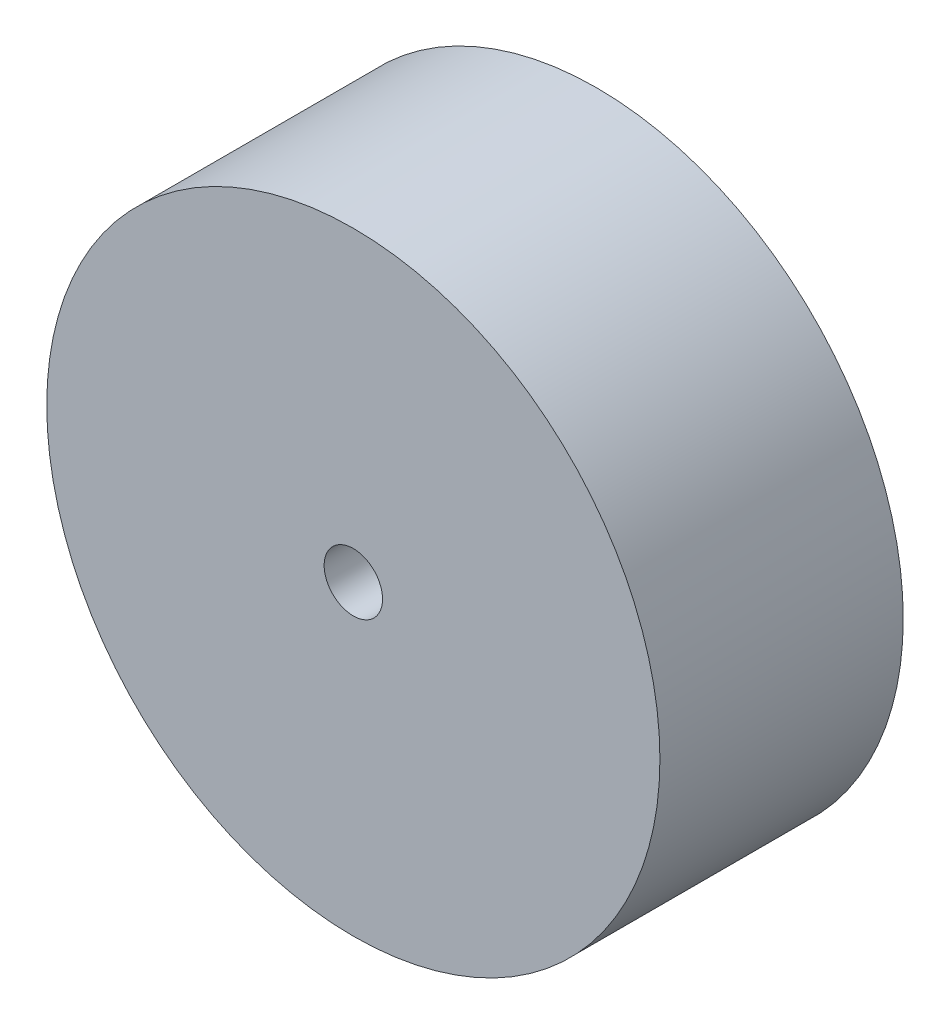
ISO-10303-21;
HEADER;
FILE_DESCRIPTION(('STEP AP214'),'2;1');
FILE_NAME('part.step','',(''),(''),'','','');
FILE_SCHEMA(('AUTOMOTIVE_DESIGN { 1 0 10303 214 1 1 1 1 }'));
ENDSEC;
DATA;
#1=APPLICATION_CONTEXT('core data for automotive mechanical design processes');
#2=APPLICATION_PROTOCOL_DEFINITION('international standard','automotive_design',2000,#1);
#3=PRODUCT_CONTEXT('',#1,'mechanical');
#4=PRODUCT('Part','Part','',(#3));
#5=PRODUCT_RELATED_PRODUCT_CATEGORY('part','',(#4));
#6=PRODUCT_DEFINITION_FORMATION('','',#4);
#7=PRODUCT_DEFINITION_CONTEXT('part definition',#1,'design');
#8=PRODUCT_DEFINITION('design','',#6,#7);
#9=PRODUCT_DEFINITION_SHAPE('','',#8);
#10=(LENGTH_UNIT() NAMED_UNIT(*) SI_UNIT(.MILLI.,.METRE.));
#11=(NAMED_UNIT(*) PLANE_ANGLE_UNIT() SI_UNIT($,.RADIAN.));
#12=(NAMED_UNIT(*) SI_UNIT($,.STERADIAN.) SOLID_ANGLE_UNIT());
#13=UNCERTAINTY_MEASURE_WITH_UNIT(LENGTH_MEASURE(1.E-05),#10,'distance_accuracy_value','');
#14=(GEOMETRIC_REPRESENTATION_CONTEXT(3) GLOBAL_UNCERTAINTY_ASSIGNED_CONTEXT((#13)) GLOBAL_UNIT_ASSIGNED_CONTEXT((#10,
#11,#12)) REPRESENTATION_CONTEXT('',''));
#15=CARTESIAN_POINT('',(0.,0.,0.));
#16=DIRECTION('',(0.,0.,1.));
#17=DIRECTION('',(1.,0.,0.));
#18=AXIS2_PLACEMENT_3D('',#15,#16,#17);
#19=CARTESIAN_POINT('',(0.,0.,25.));
#20=DIRECTION('',(0.,0.,-1.));
#21=DIRECTION('',(-1.,0.,0.));
#22=AXIS2_PLACEMENT_3D('',#19,#20,#21);
#23=CYLINDRICAL_SURFACE('',#22,31.5);
#24=CARTESIAN_POINT('',(0.,0.,25.));
#25=DIRECTION('',(0.,0.,1.));
#26=DIRECTION('',(1.,0.,0.));
#27=AXIS2_PLACEMENT_3D('',#24,#25,#26);
#28=CIRCLE('',#27,31.5);
#29=CARTESIAN_POINT('',(31.5,0.,25.));
#30=VERTEX_POINT('',#29);
#31=EDGE_CURVE('E10',#30,#30,#28,.T.);
#32=ORIENTED_EDGE('',*,*,#31,.F.);
#33=EDGE_LOOP('',(#32));
#34=FACE_BOUND('',#33,.T.);
#35=CARTESIAN_POINT('',(0.,0.,0.));
#36=DIRECTION('',(0.,0.,1.));
#37=DIRECTION('',(1.,0.,0.));
#38=AXIS2_PLACEMENT_3D('',#35,#36,#37);
#39=CIRCLE('',#38,31.5);
#40=CARTESIAN_POINT('',(31.5,0.,0.));
#41=VERTEX_POINT('',#40);
#42=EDGE_CURVE('E34',#41,#41,#39,.T.);
#43=ORIENTED_EDGE('',*,*,#42,.T.);
#44=EDGE_LOOP('',(#43));
#45=FACE_BOUND('',#44,.T.);
#46=ADVANCED_FACE('F31',(#34,#45),#23,.T.);
#47=CARTESIAN_POINT('',(0.,0.,25.));
#48=DIRECTION('',(0.,0.,1.));
#49=DIRECTION('',(1.,0.,0.));
#50=AXIS2_PLACEMENT_3D('',#47,#48,#49);
#51=PLANE('',#50);
#52=CARTESIAN_POINT('',(0.,0.,25.));
#53=DIRECTION('',(0.,0.,1.));
#54=DIRECTION('',(1.,0.,0.));
#55=AXIS2_PLACEMENT_3D('',#52,#53,#54);
#56=CIRCLE('',#55,3.);
#57=CARTESIAN_POINT('',(3.,0.,25.));
#58=VERTEX_POINT('',#57);
#59=EDGE_CURVE('E43',#58,#58,#56,.T.);
#60=ORIENTED_EDGE('',*,*,#59,.F.);
#61=EDGE_LOOP('',(#60));
#62=FACE_BOUND('',#61,.T.);
#63=ORIENTED_EDGE('',*,*,#31,.T.);
#64=EDGE_LOOP('',(#63));
#65=FACE_BOUND('',#64,.T.);
#66=ADVANCED_FACE('F58',(#62,#65),#51,.T.);
#67=CARTESIAN_POINT('',(0.,0.,0.));
#68=DIRECTION('',(0.,0.,1.));
#69=DIRECTION('',(1.,0.,0.));
#70=AXIS2_PLACEMENT_3D('',#67,#68,#69);
#71=PLANE('',#70);
#72=CARTESIAN_POINT('',(0.,0.,0.));
#73=DIRECTION('',(0.,0.,1.));
#74=DIRECTION('',(1.,0.,0.));
#75=AXIS2_PLACEMENT_3D('',#72,#73,#74);
#76=CIRCLE('',#75,3.);
#77=CARTESIAN_POINT('',(3.,0.,0.));
#78=VERTEX_POINT('',#77);
#79=EDGE_CURVE('E41',#78,#78,#76,.T.);
#80=ORIENTED_EDGE('',*,*,#79,.T.);
#81=EDGE_LOOP('',(#80));
#82=FACE_BOUND('',#81,.T.);
#83=ORIENTED_EDGE('',*,*,#42,.F.);
#84=EDGE_LOOP('',(#83));
#85=FACE_BOUND('',#84,.T.);
#86=ADVANCED_FACE('F49',(#82,#85),#71,.F.);
#87=CARTESIAN_POINT('',(0.,0.,0.));
#88=DIRECTION('',(0.,0.,1.));
#89=DIRECTION('',(1.,0.,0.));
#90=AXIS2_PLACEMENT_3D('',#87,#88,#89);
#91=CYLINDRICAL_SURFACE('',#90,3.);
#92=ORIENTED_EDGE('',*,*,#79,.F.);
#93=EDGE_LOOP('',(#92));
#94=FACE_BOUND('',#93,.T.);
#95=ORIENTED_EDGE('',*,*,#59,.T.);
#96=EDGE_LOOP('',(#95));
#97=FACE_BOUND('',#96,.T.);
#98=ADVANCED_FACE('F52',(#94,#97),#91,.F.);
#99=CLOSED_SHELL('',(#46,#66,#86,#98));
#100=MANIFOLD_SOLID_BREP('B2',#99);
#101=ADVANCED_BREP_SHAPE_REPRESENTATION('',(#18,#100),#14);
#102=SHAPE_DEFINITION_REPRESENTATION(#9,#101);
ENDSEC;
END-ISO-10303-21;
